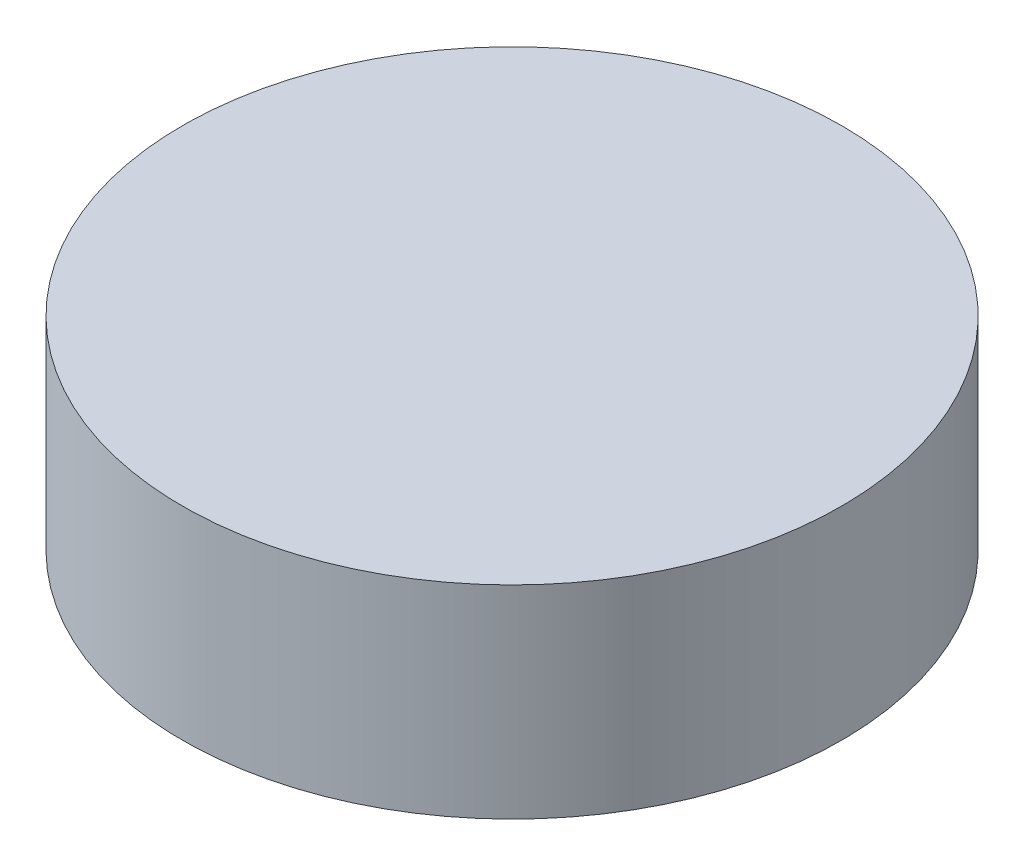
ISO-10303-21;
HEADER;
FILE_DESCRIPTION(('STEP AP214'),'2;1');
FILE_NAME('part.step','',(''),(''),'','','');
FILE_SCHEMA(('AUTOMOTIVE_DESIGN { 1 0 10303 214 1 1 1 1 }'));
ENDSEC;
DATA;
#1=APPLICATION_CONTEXT('core data for automotive mechanical design processes');
#2=APPLICATION_PROTOCOL_DEFINITION('international standard','automotive_design',2000,#1);
#3=PRODUCT_CONTEXT('',#1,'mechanical');
#4=PRODUCT('Part','Part','',(#3));
#5=PRODUCT_RELATED_PRODUCT_CATEGORY('part','',(#4));
#6=PRODUCT_DEFINITION_FORMATION('','',#4);
#7=PRODUCT_DEFINITION_CONTEXT('part definition',#1,'design');
#8=PRODUCT_DEFINITION('design','',#6,#7);
#9=PRODUCT_DEFINITION_SHAPE('','',#8);
#10=(LENGTH_UNIT() NAMED_UNIT(*) SI_UNIT(.MILLI.,.METRE.));
#11=(NAMED_UNIT(*) PLANE_ANGLE_UNIT() SI_UNIT($,.RADIAN.));
#12=(NAMED_UNIT(*) SI_UNIT($,.STERADIAN.) SOLID_ANGLE_UNIT());
#13=UNCERTAINTY_MEASURE_WITH_UNIT(LENGTH_MEASURE(1.E-05),#10,'distance_accuracy_value','');
#14=(GEOMETRIC_REPRESENTATION_CONTEXT(3) GLOBAL_UNCERTAINTY_ASSIGNED_CONTEXT((#13)) GLOBAL_UNIT_ASSIGNED_CONTEXT((#10,
#11,#12)) REPRESENTATION_CONTEXT('',''));
#15=CARTESIAN_POINT('',(0.,0.,0.));
#16=DIRECTION('',(0.,0.,1.));
#17=DIRECTION('',(1.,0.,0.));
#18=AXIS2_PLACEMENT_3D('',#15,#16,#17);
#19=CARTESIAN_POINT('',(0.,10.,0.));
#20=DIRECTION('',(0.,-1.,0.));
#21=DIRECTION('',(0.,0.,1.));
#22=AXIS2_PLACEMENT_3D('',#19,#20,#21);
#23=CYLINDRICAL_SURFACE('',#22,32.5);
#24=CARTESIAN_POINT('',(0.,10.,0.));
#25=DIRECTION('',(0.,-1.,0.));
#26=DIRECTION('',(0.,0.,-1.));
#27=AXIS2_PLACEMENT_3D('',#24,#25,#26);
#28=CIRCLE('',#27,32.5);
#29=CARTESIAN_POINT('',(0.,10.,-32.5));
#30=VERTEX_POINT('',#29);
#31=EDGE_CURVE('E10',#30,#30,#28,.T.);
#32=ORIENTED_EDGE('',*,*,#31,.T.);
#33=EDGE_LOOP('',(#32));
#34=FACE_BOUND('',#33,.T.);
#35=CARTESIAN_POINT('',(0.,-10.,0.));
#36=DIRECTION('',(0.,-1.,0.));
#37=DIRECTION('',(0.,0.,-1.));
#38=AXIS2_PLACEMENT_3D('',#35,#36,#37);
#39=CIRCLE('',#38,32.5);
#40=CARTESIAN_POINT('',(0.,-10.,-32.5));
#41=VERTEX_POINT('',#40);
#42=EDGE_CURVE('E36',#41,#41,#39,.T.);
#43=ORIENTED_EDGE('',*,*,#42,.F.);
#44=EDGE_LOOP('',(#43));
#45=FACE_BOUND('',#44,.T.);
#46=ADVANCED_FACE('F33',(#34,#45),#23,.T.);
#47=CARTESIAN_POINT('',(0.,10.,0.));
#48=DIRECTION('',(0.,1.,0.));
#49=DIRECTION('',(0.,0.,-1.));
#50=AXIS2_PLACEMENT_3D('',#47,#48,#49);
#51=PLANE('',#50);
#52=ORIENTED_EDGE('',*,*,#31,.F.);
#53=EDGE_LOOP('',(#52));
#54=FACE_BOUND('',#53,.T.);
#55=ADVANCED_FACE('F63',(#54),#51,.T.);
#56=CARTESIAN_POINT('',(0.,-10.,0.));
#57=DIRECTION('',(0.,1.,0.));
#58=DIRECTION('',(0.,0.,-1.));
#59=AXIS2_PLACEMENT_3D('',#56,#57,#58);
#60=PLANE('',#59);
#61=CARTESIAN_POINT('',(0.,-10.,0.));
#62=DIRECTION('',(0.,1.,0.));
#63=DIRECTION('',(0.,0.,1.));
#64=AXIS2_PLACEMENT_3D('',#61,#62,#63);
#65=CIRCLE('',#64,21.5);
#66=CARTESIAN_POINT('',(0.,-10.,21.5));
#67=VERTEX_POINT('',#66);
#68=EDGE_CURVE('E45',#67,#67,#65,.T.);
#69=ORIENTED_EDGE('',*,*,#68,.T.);
#70=EDGE_LOOP('',(#69));
#71=FACE_BOUND('',#70,.T.);
#72=ORIENTED_EDGE('',*,*,#42,.T.);
#73=EDGE_LOOP('',(#72));
#74=FACE_BOUND('',#73,.T.);
#75=ADVANCED_FACE('F60',(#71,#74),#60,.F.);
#76=CARTESIAN_POINT('',(0.,5.,0.));
#77=DIRECTION('',(0.,-1.,0.));
#78=DIRECTION('',(0.,0.,1.));
#79=AXIS2_PLACEMENT_3D('',#76,#77,#78);
#80=CYLINDRICAL_SURFACE('',#79,21.5);
#81=CARTESIAN_POINT('',(0.,5.,0.));
#82=DIRECTION('',(0.,1.,0.));
#83=DIRECTION('',(0.,0.,1.));
#84=AXIS2_PLACEMENT_3D('',#81,#82,#83);
#85=CIRCLE('',#84,21.5);
#86=CARTESIAN_POINT('',(0.,5.,21.5));
#87=VERTEX_POINT('',#86);
#88=EDGE_CURVE('E43',#87,#87,#85,.T.);
#89=ORIENTED_EDGE('',*,*,#88,.T.);
#90=EDGE_LOOP('',(#89));
#91=FACE_BOUND('',#90,.T.);
#92=ORIENTED_EDGE('',*,*,#68,.F.);
#93=EDGE_LOOP('',(#92));
#94=FACE_BOUND('',#93,.T.);
#95=ADVANCED_FACE('F51',(#91,#94),#80,.F.);
#96=CARTESIAN_POINT('',(0.,5.,0.));
#97=DIRECTION('',(0.,-1.,0.));
#98=DIRECTION('',(0.,0.,1.));
#99=AXIS2_PLACEMENT_3D('',#96,#97,#98);
#100=PLANE('',#99);
#101=ORIENTED_EDGE('',*,*,#88,.F.);
#102=EDGE_LOOP('',(#101));
#103=FACE_BOUND('',#102,.T.);
#104=ADVANCED_FACE('F54',(#103),#100,.T.);
#105=CLOSED_SHELL('',(#46,#55,#75,#95,#104));
#106=MANIFOLD_SOLID_BREP('B2',#105);
#107=ADVANCED_BREP_SHAPE_REPRESENTATION('',(#18,#106),#14);
#108=SHAPE_DEFINITION_REPRESENTATION(#9,#107);
ENDSEC;
END-ISO-10303-21;
